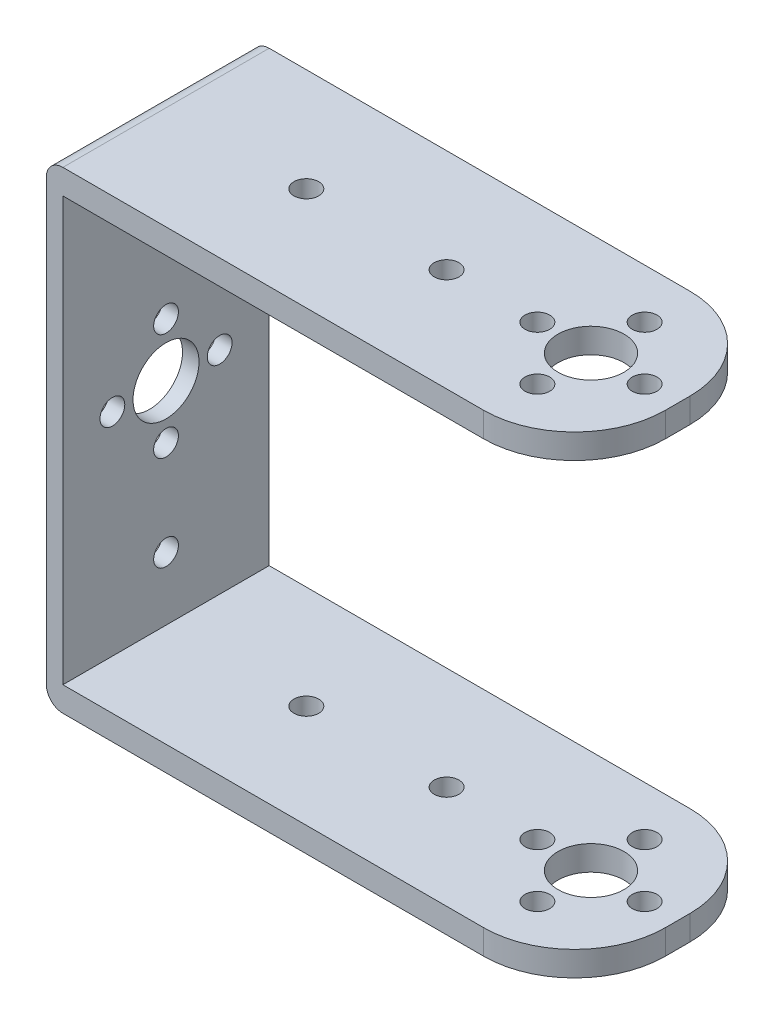
ISO-10303-21;
HEADER;
FILE_DESCRIPTION(('STEP AP214'),'2;1');
FILE_NAME('part.step','',(''),(''),'','','');
FILE_SCHEMA(('AUTOMOTIVE_DESIGN { 1 0 10303 214 1 1 1 1 }'));
ENDSEC;
DATA;
#1=APPLICATION_CONTEXT('core data for automotive mechanical design processes');
#2=APPLICATION_PROTOCOL_DEFINITION('international standard','automotive_design',2000,#1);
#3=PRODUCT_CONTEXT('',#1,'mechanical');
#4=PRODUCT('Part','Part','',(#3));
#5=PRODUCT_RELATED_PRODUCT_CATEGORY('part','',(#4));
#6=PRODUCT_DEFINITION_FORMATION('','',#4);
#7=PRODUCT_DEFINITION_CONTEXT('part definition',#1,'design');
#8=PRODUCT_DEFINITION('design','',#6,#7);
#9=PRODUCT_DEFINITION_SHAPE('','',#8);
#10=(LENGTH_UNIT() NAMED_UNIT(*) SI_UNIT(.MILLI.,.METRE.));
#11=(NAMED_UNIT(*) PLANE_ANGLE_UNIT() SI_UNIT($,.RADIAN.));
#12=(NAMED_UNIT(*) SI_UNIT($,.STERADIAN.) SOLID_ANGLE_UNIT());
#13=UNCERTAINTY_MEASURE_WITH_UNIT(LENGTH_MEASURE(1.E-05),#10,'distance_accuracy_value','');
#14=(GEOMETRIC_REPRESENTATION_CONTEXT(3) GLOBAL_UNCERTAINTY_ASSIGNED_CONTEXT((#13)) GLOBAL_UNIT_ASSIGNED_CONTEXT((#10,
#11,#12)) REPRESENTATION_CONTEXT('',''));
#15=CARTESIAN_POINT('',(0.,0.,0.));
#16=DIRECTION('',(0.,0.,1.));
#17=DIRECTION('',(1.,0.,0.));
#18=AXIS2_PLACEMENT_3D('',#15,#16,#17);
#19=CARTESIAN_POINT('',(64.,-1.,0.));
#20=DIRECTION('',(1.,0.,0.));
#21=DIRECTION('',(0.,0.,-1.));
#22=AXIS2_PLACEMENT_3D('',#19,#20,#21);
#23=PLANE('',#22);
#24=DIRECTION('',(0.,0.,-1.));
#25=VECTOR('',#24,1.);
#26=CARTESIAN_POINT('',(64.,56.3,0.));
#27=LINE('',#26,#25);
#28=CARTESIAN_POINT('',(64.,56.3,-11.));
#29=VERTEX_POINT('',#28);
#30=CARTESIAN_POINT('',(64.,56.3,-14.));
#31=VERTEX_POINT('',#30);
#32=EDGE_CURVE('E182',#29,#31,#27,.T.);
#33=ORIENTED_EDGE('',*,*,#32,.F.);
#34=DIRECTION('',(0.,1.,0.));
#35=VECTOR('',#34,1.);
#36=CARTESIAN_POINT('',(64.,-1.,-11.));
#37=LINE('',#36,#35);
#38=CARTESIAN_POINT('',(64.,53.3,-11.));
#39=VERTEX_POINT('',#38);
#40=EDGE_CURVE('E52',#29,#39,#37,.F.);
#41=ORIENTED_EDGE('',*,*,#40,.T.);
#42=DIRECTION('',(0.,0.,1.));
#43=VECTOR('',#42,1.);
#44=CARTESIAN_POINT('',(64.,53.3,-25.));
#45=LINE('',#44,#43);
#46=CARTESIAN_POINT('',(64.,53.3,-14.));
#47=VERTEX_POINT('',#46);
#48=EDGE_CURVE('E176',#47,#39,#45,.T.);
#49=ORIENTED_EDGE('',*,*,#48,.F.);
#50=DIRECTION('',(0.,1.,0.));
#51=VECTOR('',#50,1.);
#52=CARTESIAN_POINT('',(64.,-1.,-14.));
#53=LINE('',#52,#51);
#54=EDGE_CURVE('E268',#47,#31,#53,.T.);
#55=ORIENTED_EDGE('',*,*,#54,.T.);
#56=EDGE_LOOP('',(#33,#41,#49,#55));
#57=FACE_BOUND('',#56,.T.);
#58=ADVANCED_FACE('F35',(#57),#23,.T.);
#59=CARTESIAN_POINT('',(0.,-1.,0.));
#60=DIRECTION('',(-1.,0.,0.));
#61=DIRECTION('',(0.,0.,1.));
#62=AXIS2_PLACEMENT_3D('',#59,#60,#61);
#63=PLANE('',#62);
#64=CARTESIAN_POINT('',(0.,45.65,-12.5));
#65=DIRECTION('',(-1.,0.,0.));
#66=DIRECTION('',(0.,0.,1.));
#67=AXIS2_PLACEMENT_3D('',#64,#65,#66);
#68=CIRCLE('',#67,1.5);
#69=CARTESIAN_POINT('',(0.,45.65,-11.));
#70=VERTEX_POINT('',#69);
#71=EDGE_CURVE('E345',#70,#70,#68,.T.);
#72=ORIENTED_EDGE('',*,*,#71,.F.);
#73=EDGE_LOOP('',(#72));
#74=FACE_BOUND('',#73,.T.);
#75=CARTESIAN_POINT('',(0.,9.65,-12.5));
#76=DIRECTION('',(-1.,0.,0.));
#77=DIRECTION('',(0.,0.,1.));
#78=AXIS2_PLACEMENT_3D('',#75,#76,#77);
#79=CIRCLE('',#78,1.5);
#80=CARTESIAN_POINT('',(0.,9.65,-11.));
#81=VERTEX_POINT('',#80);
#82=EDGE_CURVE('E340',#81,#81,#79,.T.);
#83=ORIENTED_EDGE('',*,*,#82,.F.);
#84=EDGE_LOOP('',(#83));
#85=FACE_BOUND('',#84,.T.);
#86=CARTESIAN_POINT('',(0.,27.65,-19.));
#87=DIRECTION('',(-1.,0.,0.));
#88=DIRECTION('',(0.,0.,1.));
#89=AXIS2_PLACEMENT_3D('',#86,#87,#88);
#90=CIRCLE('',#89,1.5);
#91=CARTESIAN_POINT('',(0.,27.65,-17.5));
#92=VERTEX_POINT('',#91);
#93=EDGE_CURVE('E167',#92,#92,#90,.T.);
#94=ORIENTED_EDGE('',*,*,#93,.F.);
#95=EDGE_LOOP('',(#94));
#96=FACE_BOUND('',#95,.T.);
#97=CARTESIAN_POINT('',(0.,34.15,-12.5));
#98=DIRECTION('',(-1.,0.,0.));
#99=DIRECTION('',(0.,0.,1.));
#100=AXIS2_PLACEMENT_3D('',#97,#98,#99);
#101=CIRCLE('',#100,1.5);
#102=CARTESIAN_POINT('',(0.,34.15,-11.));
#103=VERTEX_POINT('',#102);
#104=EDGE_CURVE('E371',#103,#103,#101,.T.);
#105=ORIENTED_EDGE('',*,*,#104,.F.);
#106=EDGE_LOOP('',(#105));
#107=FACE_BOUND('',#106,.T.);
#108=CARTESIAN_POINT('',(0.,27.65,-6.));
#109=DIRECTION('',(-1.,0.,0.));
#110=DIRECTION('',(0.,0.,1.));
#111=AXIS2_PLACEMENT_3D('',#108,#109,#110);
#112=CIRCLE('',#111,1.5);
#113=CARTESIAN_POINT('',(0.,27.65,-4.5));
#114=VERTEX_POINT('',#113);
#115=EDGE_CURVE('E369',#114,#114,#112,.T.);
#116=ORIENTED_EDGE('',*,*,#115,.F.);
#117=EDGE_LOOP('',(#116));
#118=FACE_BOUND('',#117,.T.);
#119=CARTESIAN_POINT('',(0.,21.15,-12.5));
#120=DIRECTION('',(-1.,0.,0.));
#121=DIRECTION('',(0.,0.,1.));
#122=AXIS2_PLACEMENT_3D('',#119,#120,#121);
#123=CIRCLE('',#122,1.5);
#124=CARTESIAN_POINT('',(0.,21.15,-11.));
#125=VERTEX_POINT('',#124);
#126=EDGE_CURVE('E366',#125,#125,#123,.T.);
#127=ORIENTED_EDGE('',*,*,#126,.F.);
#128=EDGE_LOOP('',(#127));
#129=FACE_BOUND('',#128,.T.);
#130=CARTESIAN_POINT('',(0.,27.65,-12.5));
#131=DIRECTION('',(-1.,0.,0.));
#132=DIRECTION('',(0.,0.,1.));
#133=AXIS2_PLACEMENT_3D('',#130,#131,#132);
#134=CIRCLE('',#133,4.);
#135=CARTESIAN_POINT('',(0.,27.65,-8.5));
#136=VERTEX_POINT('',#135);
#137=EDGE_CURVE('E363',#136,#136,#134,.T.);
#138=ORIENTED_EDGE('',*,*,#137,.F.);
#139=EDGE_LOOP('',(#138));
#140=FACE_BOUND('',#139,.T.);
#141=DIRECTION('',(0.,1.,0.));
#142=VECTOR('',#141,1.);
#143=CARTESIAN_POINT('',(0.,-1.,0.));
#144=LINE('',#143,#142);
#145=CARTESIAN_POINT('',(0.,1.,0.));
#146=VERTEX_POINT('',#145);
#147=CARTESIAN_POINT('',(0.,54.3,0.));
#148=VERTEX_POINT('',#147);
#149=EDGE_CURVE('E195',#146,#148,#144,.T.);
#150=ORIENTED_EDGE('',*,*,#149,.T.);
#151=DIRECTION('',(0.,0.,1.));
#152=VECTOR('',#151,1.);
#153=CARTESIAN_POINT('',(0.,54.3,-25.));
#154=LINE('',#153,#152);
#155=CARTESIAN_POINT('',(0.,54.3,-25.));
#156=VERTEX_POINT('',#155);
#157=EDGE_CURVE('E211',#148,#156,#154,.F.);
#158=ORIENTED_EDGE('',*,*,#157,.T.);
#159=DIRECTION('',(0.,1.,0.));
#160=VECTOR('',#159,1.);
#161=CARTESIAN_POINT('',(0.,-1.,-25.));
#162=LINE('',#161,#160);
#163=CARTESIAN_POINT('',(0.,1.,-25.));
#164=VERTEX_POINT('',#163);
#165=EDGE_CURVE('E196',#164,#156,#162,.T.);
#166=ORIENTED_EDGE('',*,*,#165,.F.);
#167=DIRECTION('',(0.,0.,1.));
#168=VECTOR('',#167,1.);
#169=CARTESIAN_POINT('',(0.,1.,0.));
#170=LINE('',#169,#168);
#171=EDGE_CURVE('E208',#164,#146,#170,.T.);
#172=ORIENTED_EDGE('',*,*,#171,.T.);
#173=EDGE_LOOP('',(#150,#158,#166,#172));
#174=FACE_BOUND('',#173,.T.);
#175=ADVANCED_FACE('F381',(#74,#85,#96,#107,#118,#129,#140,#174),#63,.T.);
#176=CARTESIAN_POINT('',(0.,-1.,-25.));
#177=DIRECTION('',(0.,0.,-1.));
#178=DIRECTION('',(-1.,0.,0.));
#179=AXIS2_PLACEMENT_3D('',#176,#177,#178);
#180=PLANE('',#179);
#181=DIRECTION('',(1.,0.,0.));
#182=VECTOR('',#181,1.);
#183=CARTESIAN_POINT('',(2.00000000000001,2.,-25.));
#184=LINE('',#183,#182);
#185=CARTESIAN_POINT('',(2.00000000000001,2.,-25.));
#186=VERTEX_POINT('',#185);
#187=CARTESIAN_POINT('',(53.,2.,-25.));
#188=VERTEX_POINT('',#187);
#189=EDGE_CURVE('E153',#186,#188,#184,.T.);
#190=ORIENTED_EDGE('',*,*,#189,.T.);
#191=DIRECTION('',(0.,1.,0.));
#192=VECTOR('',#191,1.);
#193=CARTESIAN_POINT('',(53.,-1.,-25.));
#194=LINE('',#193,#192);
#195=CARTESIAN_POINT('',(53.,-1.,-25.));
#196=VERTEX_POINT('',#195);
#197=EDGE_CURVE('E252',#188,#196,#194,.F.);
#198=ORIENTED_EDGE('',*,*,#197,.T.);
#199=DIRECTION('',(-1.,0.,0.));
#200=VECTOR('',#199,1.);
#201=CARTESIAN_POINT('',(0.,-1.,-25.));
#202=LINE('',#201,#200);
#203=CARTESIAN_POINT('',(2.,-1.,-25.));
#204=VERTEX_POINT('',#203);
#205=EDGE_CURVE('E193',#196,#204,#202,.T.);
#206=ORIENTED_EDGE('',*,*,#205,.T.);
#207=CARTESIAN_POINT('',(2.,1.,-25.));
#208=DIRECTION('',(0.,0.,-1.));
#209=DIRECTION('',(-1.,0.,0.));
#210=AXIS2_PLACEMENT_3D('',#207,#208,#209);
#211=CIRCLE('',#210,2.);
#212=EDGE_CURVE('E213',#204,#164,#211,.T.);
#213=ORIENTED_EDGE('',*,*,#212,.T.);
#214=ORIENTED_EDGE('',*,*,#165,.T.);
#215=CARTESIAN_POINT('',(2.,54.3,-25.));
#216=DIRECTION('',(0.,0.,-1.));
#217=DIRECTION('',(-1.,0.,0.));
#218=AXIS2_PLACEMENT_3D('',#215,#216,#217);
#219=CIRCLE('',#218,2.);
#220=CARTESIAN_POINT('',(2.,56.3,-25.));
#221=VERTEX_POINT('',#220);
#222=EDGE_CURVE('E215',#156,#221,#219,.T.);
#223=ORIENTED_EDGE('',*,*,#222,.T.);
#224=DIRECTION('',(-1.,0.,0.));
#225=VECTOR('',#224,1.);
#226=CARTESIAN_POINT('',(0.,56.3,-25.));
#227=LINE('',#226,#225);
#228=CARTESIAN_POINT('',(53.,56.3,-25.));
#229=VERTEX_POINT('',#228);
#230=EDGE_CURVE('E185',#229,#221,#227,.T.);
#231=ORIENTED_EDGE('',*,*,#230,.F.);
#232=DIRECTION('',(0.,1.,0.));
#233=VECTOR('',#232,1.);
#234=CARTESIAN_POINT('',(53.,-1.,-25.));
#235=LINE('',#234,#233);
#236=CARTESIAN_POINT('',(53.,53.3,-25.));
#237=VERTEX_POINT('',#236);
#238=EDGE_CURVE('E250',#229,#237,#235,.F.);
#239=ORIENTED_EDGE('',*,*,#238,.T.);
#240=DIRECTION('',(-1.,0.,0.));
#241=VECTOR('',#240,1.);
#242=CARTESIAN_POINT('',(2.,53.3,-25.));
#243=LINE('',#242,#241);
#244=CARTESIAN_POINT('',(2.,53.3,-25.));
#245=VERTEX_POINT('',#244);
#246=EDGE_CURVE('E150',#237,#245,#243,.T.);
#247=ORIENTED_EDGE('',*,*,#246,.T.);
#248=DIRECTION('',(0.,-1.,0.));
#249=VECTOR('',#248,1.);
#250=CARTESIAN_POINT('',(2.,53.3,-25.));
#251=LINE('',#250,#249);
#252=EDGE_CURVE('E143',#245,#186,#251,.T.);
#253=ORIENTED_EDGE('',*,*,#252,.T.);
#254=EDGE_LOOP('',(#190,#198,#206,#213,#214,#223,#231,#239,#247,#253));
#255=FACE_BOUND('',#254,.T.);
#256=ADVANCED_FACE('F160',(#255),#180,.T.);
#257=DIRECTION('',(0.,0.,-1.));
#258=VECTOR('',#257,1.);
#259=CARTESIAN_POINT('',(64.,-1.,0.));
#260=LINE('',#259,#258);
#261=CARTESIAN_POINT('',(64.,-1.,-11.));
#262=VERTEX_POINT('',#261);
#263=CARTESIAN_POINT('',(64.,-1.,-14.));
#264=VERTEX_POINT('',#263);
#265=EDGE_CURVE('E190',#262,#264,#260,.T.);
#266=ORIENTED_EDGE('',*,*,#265,.T.);
#267=DIRECTION('',(0.,1.,0.));
#268=VECTOR('',#267,1.);
#269=CARTESIAN_POINT('',(64.,-1.,-14.));
#270=LINE('',#269,#268);
#271=CARTESIAN_POINT('',(64.,2.,-14.));
#272=VERTEX_POINT('',#271);
#273=EDGE_CURVE('E244',#264,#272,#270,.T.);
#274=ORIENTED_EDGE('',*,*,#273,.T.);
#275=DIRECTION('',(0.,0.,1.));
#276=VECTOR('',#275,1.);
#277=CARTESIAN_POINT('',(64.,2.,-25.));
#278=LINE('',#277,#276);
#279=CARTESIAN_POINT('',(64.,2.,-11.));
#280=VERTEX_POINT('',#279);
#281=EDGE_CURVE('E149',#272,#280,#278,.T.);
#282=ORIENTED_EDGE('',*,*,#281,.T.);
#283=DIRECTION('',(0.,1.,0.));
#284=VECTOR('',#283,1.);
#285=CARTESIAN_POINT('',(64.,-1.,-11.));
#286=LINE('',#285,#284);
#287=EDGE_CURVE('E221',#280,#262,#286,.F.);
#288=ORIENTED_EDGE('',*,*,#287,.T.);
#289=EDGE_LOOP('',(#266,#274,#282,#288));
#290=FACE_BOUND('',#289,.T.);
#291=ADVANCED_FACE('F420',(#290),#23,.T.);
#292=CARTESIAN_POINT('',(0.,-1.,0.));
#293=DIRECTION('',(0.,0.,1.));
#294=DIRECTION('',(1.,0.,0.));
#295=AXIS2_PLACEMENT_3D('',#292,#293,#294);
#296=PLANE('',#295);
#297=DIRECTION('',(1.,0.,0.));
#298=VECTOR('',#297,1.);
#299=CARTESIAN_POINT('',(0.,-1.,0.));
#300=LINE('',#299,#298);
#301=CARTESIAN_POINT('',(2.,-1.,0.));
#302=VERTEX_POINT('',#301);
#303=CARTESIAN_POINT('',(53.,-1.,0.));
#304=VERTEX_POINT('',#303);
#305=EDGE_CURVE('E187',#302,#304,#300,.T.);
#306=ORIENTED_EDGE('',*,*,#305,.T.);
#307=DIRECTION('',(0.,1.,0.));
#308=VECTOR('',#307,1.);
#309=CARTESIAN_POINT('',(53.,-1.,0.));
#310=LINE('',#309,#308);
#311=CARTESIAN_POINT('',(53.,2.,0.));
#312=VERTEX_POINT('',#311);
#313=EDGE_CURVE('E261',#304,#312,#310,.T.);
#314=ORIENTED_EDGE('',*,*,#313,.T.);
#315=DIRECTION('',(1.,0.,0.));
#316=VECTOR('',#315,1.);
#317=CARTESIAN_POINT('',(2.00000000000001,2.,0.));
#318=LINE('',#317,#316);
#319=CARTESIAN_POINT('',(2.00000000000001,2.,0.));
#320=VERTEX_POINT('',#319);
#321=EDGE_CURVE('E164',#320,#312,#318,.T.);
#322=ORIENTED_EDGE('',*,*,#321,.F.);
#323=DIRECTION('',(0.,-1.,0.));
#324=VECTOR('',#323,1.);
#325=CARTESIAN_POINT('',(2.,53.3,0.));
#326=LINE('',#325,#324);
#327=CARTESIAN_POINT('',(2.,53.3,0.));
#328=VERTEX_POINT('',#327);
#329=EDGE_CURVE('E145',#328,#320,#326,.T.);
#330=ORIENTED_EDGE('',*,*,#329,.F.);
#331=DIRECTION('',(-1.,0.,0.));
#332=VECTOR('',#331,1.);
#333=CARTESIAN_POINT('',(2.,53.3,0.));
#334=LINE('',#333,#332);
#335=CARTESIAN_POINT('',(53.,53.3,0.));
#336=VERTEX_POINT('',#335);
#337=EDGE_CURVE('E162',#336,#328,#334,.T.);
#338=ORIENTED_EDGE('',*,*,#337,.F.);
#339=DIRECTION('',(0.,1.,0.));
#340=VECTOR('',#339,1.);
#341=CARTESIAN_POINT('',(53.,-1.,0.));
#342=LINE('',#341,#340);
#343=CARTESIAN_POINT('',(53.,56.3,0.));
#344=VERTEX_POINT('',#343);
#345=EDGE_CURVE('E258',#336,#344,#342,.T.);
#346=ORIENTED_EDGE('',*,*,#345,.T.);
#347=DIRECTION('',(1.,0.,0.));
#348=VECTOR('',#347,1.);
#349=CARTESIAN_POINT('',(0.,56.3,0.));
#350=LINE('',#349,#348);
#351=CARTESIAN_POINT('',(2.,56.3,0.));
#352=VERTEX_POINT('',#351);
#353=EDGE_CURVE('E175',#352,#344,#350,.T.);
#354=ORIENTED_EDGE('',*,*,#353,.F.);
#355=CARTESIAN_POINT('',(2.,54.3,0.));
#356=DIRECTION('',(0.,0.,1.));
#357=DIRECTION('',(1.,0.,0.));
#358=AXIS2_PLACEMENT_3D('',#355,#356,#357);
#359=CIRCLE('',#358,2.);
#360=EDGE_CURVE('E206',#352,#148,#359,.T.);
#361=ORIENTED_EDGE('',*,*,#360,.T.);
#362=ORIENTED_EDGE('',*,*,#149,.F.);
#363=CARTESIAN_POINT('',(2.,1.,0.));
#364=DIRECTION('',(0.,0.,1.));
#365=DIRECTION('',(1.,0.,0.));
#366=AXIS2_PLACEMENT_3D('',#363,#364,#365);
#367=CIRCLE('',#366,2.);
#368=EDGE_CURVE('E204',#146,#302,#367,.T.);
#369=ORIENTED_EDGE('',*,*,#368,.T.);
#370=EDGE_LOOP('',(#306,#314,#322,#330,#338,#346,#354,#361,#362,#369));
#371=FACE_BOUND('',#370,.T.);
#372=ADVANCED_FACE('F409',(#371),#296,.T.);
#373=CARTESIAN_POINT('',(0.,-1.,0.));
#374=DIRECTION('',(0.,-1.,0.));
#375=DIRECTION('',(0.,0.,-1.));
#376=AXIS2_PLACEMENT_3D('',#373,#374,#375);
#377=PLANE('',#376);
#378=CARTESIAN_POINT('',(36.,-1.,-12.5));
#379=DIRECTION('',(0.,1.,0.));
#380=DIRECTION('',(0.,0.,1.));
#381=AXIS2_PLACEMENT_3D('',#378,#379,#380);
#382=CIRCLE('',#381,1.5);
#383=CARTESIAN_POINT('',(36.,-1.,-11.));
#384=VERTEX_POINT('',#383);
#385=EDGE_CURVE('E275',#384,#384,#382,.T.);
#386=ORIENTED_EDGE('',*,*,#385,.T.);
#387=EDGE_LOOP('',(#386));
#388=FACE_BOUND('',#387,.T.);
#389=CARTESIAN_POINT('',(19.,-1.,-12.5));
#390=DIRECTION('',(0.,1.,0.));
#391=DIRECTION('',(0.,0.,1.));
#392=AXIS2_PLACEMENT_3D('',#389,#390,#391);
#393=CIRCLE('',#392,1.5);
#394=CARTESIAN_POINT('',(19.,-1.,-11.));
#395=VERTEX_POINT('',#394);
#396=EDGE_CURVE('E286',#395,#395,#393,.T.);
#397=ORIENTED_EDGE('',*,*,#396,.T.);
#398=EDGE_LOOP('',(#397));
#399=FACE_BOUND('',#398,.T.);
#400=CARTESIAN_POINT('',(60.,-1.,-12.5));
#401=DIRECTION('',(0.,1.,0.));
#402=DIRECTION('',(0.,0.,1.));
#403=AXIS2_PLACEMENT_3D('',#400,#401,#402);
#404=CIRCLE('',#403,1.5);
#405=CARTESIAN_POINT('',(60.,-1.,-11.));
#406=VERTEX_POINT('',#405);
#407=EDGE_CURVE('E226',#406,#406,#404,.T.);
#408=ORIENTED_EDGE('',*,*,#407,.T.);
#409=EDGE_LOOP('',(#408));
#410=FACE_BOUND('',#409,.T.);
#411=CARTESIAN_POINT('',(53.5,-1.,-6.));
#412=DIRECTION('',(0.,1.,0.));
#413=DIRECTION('',(0.,0.,1.));
#414=AXIS2_PLACEMENT_3D('',#411,#412,#413);
#415=CIRCLE('',#414,1.5);
#416=CARTESIAN_POINT('',(53.5,-1.,-4.5));
#417=VERTEX_POINT('',#416);
#418=EDGE_CURVE('E311',#417,#417,#415,.T.);
#419=ORIENTED_EDGE('',*,*,#418,.T.);
#420=EDGE_LOOP('',(#419));
#421=FACE_BOUND('',#420,.T.);
#422=CARTESIAN_POINT('',(47.,-1.,-12.5));
#423=DIRECTION('',(0.,1.,0.));
#424=DIRECTION('',(0.,0.,1.));
#425=AXIS2_PLACEMENT_3D('',#422,#423,#424);
#426=CIRCLE('',#425,1.5);
#427=CARTESIAN_POINT('',(47.,-1.,-11.));
#428=VERTEX_POINT('',#427);
#429=EDGE_CURVE('E304',#428,#428,#426,.T.);
#430=ORIENTED_EDGE('',*,*,#429,.T.);
#431=EDGE_LOOP('',(#430));
#432=FACE_BOUND('',#431,.T.);
#433=CARTESIAN_POINT('',(53.5,-1.,-19.));
#434=DIRECTION('',(0.,1.,0.));
#435=DIRECTION('',(0.,0.,1.));
#436=AXIS2_PLACEMENT_3D('',#433,#434,#435);
#437=CIRCLE('',#436,1.5);
#438=CARTESIAN_POINT('',(53.5,-1.,-17.5));
#439=VERTEX_POINT('',#438);
#440=EDGE_CURVE('E321',#439,#439,#437,.T.);
#441=ORIENTED_EDGE('',*,*,#440,.T.);
#442=EDGE_LOOP('',(#441));
#443=FACE_BOUND('',#442,.T.);
#444=CARTESIAN_POINT('',(53.5,-1.,-12.5));
#445=DIRECTION('',(0.,1.,0.));
#446=DIRECTION('',(0.,0.,1.));
#447=AXIS2_PLACEMENT_3D('',#444,#445,#446);
#448=CIRCLE('',#447,4.00000000000001);
#449=CARTESIAN_POINT('',(53.5,-1.,-8.49999999999999));
#450=VERTEX_POINT('',#449);
#451=EDGE_CURVE('E303',#450,#450,#448,.T.);
#452=ORIENTED_EDGE('',*,*,#451,.T.);
#453=EDGE_LOOP('',(#452));
#454=FACE_BOUND('',#453,.T.);
#455=ORIENTED_EDGE('',*,*,#205,.F.);
#456=CARTESIAN_POINT('',(53.,-1.,-14.));
#457=DIRECTION('',(0.,-1.,0.));
#458=DIRECTION('',(0.,0.,-1.));
#459=AXIS2_PLACEMENT_3D('',#456,#457,#458);
#460=CIRCLE('',#459,11.);
#461=EDGE_CURVE('E256',#196,#264,#460,.T.);
#462=ORIENTED_EDGE('',*,*,#461,.T.);
#463=ORIENTED_EDGE('',*,*,#265,.F.);
#464=CARTESIAN_POINT('',(53.,-1.,-11.));
#465=DIRECTION('',(0.,-1.,0.));
#466=DIRECTION('',(0.,0.,-1.));
#467=AXIS2_PLACEMENT_3D('',#464,#465,#466);
#468=CIRCLE('',#467,11.);
#469=EDGE_CURVE('E254',#262,#304,#468,.T.);
#470=ORIENTED_EDGE('',*,*,#469,.T.);
#471=ORIENTED_EDGE('',*,*,#305,.F.);
#472=DIRECTION('',(0.,0.,1.));
#473=VECTOR('',#472,1.);
#474=CARTESIAN_POINT('',(2.,-1.,0.));
#475=LINE('',#474,#473);
#476=EDGE_CURVE('E218',#302,#204,#475,.F.);
#477=ORIENTED_EDGE('',*,*,#476,.T.);
#478=EDGE_LOOP('',(#455,#462,#463,#470,#471,#477));
#479=FACE_BOUND('',#478,.T.);
#480=ADVANCED_FACE('F413',(#388,#399,#410,#421,#432,#443,#454,#479),#377,.T.);
#481=CARTESIAN_POINT('',(0.,56.3,0.));
#482=DIRECTION('',(0.,-1.,0.));
#483=DIRECTION('',(0.,0.,-1.));
#484=AXIS2_PLACEMENT_3D('',#481,#482,#483);
#485=PLANE('',#484);
#486=CARTESIAN_POINT('',(36.,56.3,-12.5));
#487=DIRECTION('',(0.,1.,0.));
#488=DIRECTION('',(0.,0.,1.));
#489=AXIS2_PLACEMENT_3D('',#486,#487,#488);
#490=CIRCLE('',#489,1.5);
#491=CARTESIAN_POINT('',(36.,56.3,-11.));
#492=VERTEX_POINT('',#491);
#493=EDGE_CURVE('E281',#492,#492,#490,.T.);
#494=ORIENTED_EDGE('',*,*,#493,.F.);
#495=EDGE_LOOP('',(#494));
#496=FACE_BOUND('',#495,.T.);
#497=CARTESIAN_POINT('',(19.,56.3,-12.5));
#498=DIRECTION('',(0.,1.,0.));
#499=DIRECTION('',(0.,0.,1.));
#500=AXIS2_PLACEMENT_3D('',#497,#498,#499);
#501=CIRCLE('',#500,1.5);
#502=CARTESIAN_POINT('',(19.,56.3,-11.));
#503=VERTEX_POINT('',#502);
#504=EDGE_CURVE('E291',#503,#503,#501,.T.);
#505=ORIENTED_EDGE('',*,*,#504,.F.);
#506=EDGE_LOOP('',(#505));
#507=FACE_BOUND('',#506,.T.);
#508=CARTESIAN_POINT('',(60.,56.3,-12.5));
#509=DIRECTION('',(0.,1.,0.));
#510=DIRECTION('',(0.,0.,1.));
#511=AXIS2_PLACEMENT_3D('',#508,#509,#510);
#512=CIRCLE('',#511,1.5);
#513=CARTESIAN_POINT('',(60.,56.3,-11.));
#514=VERTEX_POINT('',#513);
#515=EDGE_CURVE('E300',#514,#514,#512,.T.);
#516=ORIENTED_EDGE('',*,*,#515,.F.);
#517=EDGE_LOOP('',(#516));
#518=FACE_BOUND('',#517,.T.);
#519=CARTESIAN_POINT('',(53.5,56.3,-6.));
#520=DIRECTION('',(0.,1.,0.));
#521=DIRECTION('',(0.,0.,1.));
#522=AXIS2_PLACEMENT_3D('',#519,#520,#521);
#523=CIRCLE('',#522,1.5);
#524=CARTESIAN_POINT('',(53.5,56.3,-4.5));
#525=VERTEX_POINT('',#524);
#526=EDGE_CURVE('E297',#525,#525,#523,.T.);
#527=ORIENTED_EDGE('',*,*,#526,.F.);
#528=EDGE_LOOP('',(#527));
#529=FACE_BOUND('',#528,.T.);
#530=CARTESIAN_POINT('',(47.,56.3,-12.5));
#531=DIRECTION('',(0.,1.,0.));
#532=DIRECTION('',(0.,0.,1.));
#533=AXIS2_PLACEMENT_3D('',#530,#531,#532);
#534=CIRCLE('',#533,1.5);
#535=CARTESIAN_POINT('',(47.,56.3,-11.));
#536=VERTEX_POINT('',#535);
#537=EDGE_CURVE('E308',#536,#536,#534,.T.);
#538=ORIENTED_EDGE('',*,*,#537,.F.);
#539=EDGE_LOOP('',(#538));
#540=FACE_BOUND('',#539,.T.);
#541=CARTESIAN_POINT('',(53.5,56.3,-19.));
#542=DIRECTION('',(0.,1.,0.));
#543=DIRECTION('',(0.,0.,1.));
#544=AXIS2_PLACEMENT_3D('',#541,#542,#543);
#545=CIRCLE('',#544,1.5);
#546=CARTESIAN_POINT('',(53.5,56.3,-17.5));
#547=VERTEX_POINT('',#546);
#548=EDGE_CURVE('E307',#547,#547,#545,.T.);
#549=ORIENTED_EDGE('',*,*,#548,.F.);
#550=EDGE_LOOP('',(#549));
#551=FACE_BOUND('',#550,.T.);
#552=CARTESIAN_POINT('',(53.5,56.3,-12.5));
#553=DIRECTION('',(0.,1.,0.));
#554=DIRECTION('',(0.,0.,1.));
#555=AXIS2_PLACEMENT_3D('',#552,#553,#554);
#556=CIRCLE('',#555,4.00000000000001);
#557=CARTESIAN_POINT('',(53.5,56.3,-8.49999999999999));
#558=VERTEX_POINT('',#557);
#559=EDGE_CURVE('E318',#558,#558,#556,.T.);
#560=ORIENTED_EDGE('',*,*,#559,.F.);
#561=EDGE_LOOP('',(#560));
#562=FACE_BOUND('',#561,.T.);
#563=ORIENTED_EDGE('',*,*,#353,.T.);
#564=CARTESIAN_POINT('',(53.,56.3,-11.));
#565=DIRECTION('',(0.,-1.,0.));
#566=DIRECTION('',(0.,0.,-1.));
#567=AXIS2_PLACEMENT_3D('',#564,#565,#566);
#568=CIRCLE('',#567,11.);
#569=EDGE_CURVE('E266',#344,#29,#568,.F.);
#570=ORIENTED_EDGE('',*,*,#569,.T.);
#571=ORIENTED_EDGE('',*,*,#32,.T.);
#572=CARTESIAN_POINT('',(53.,56.3,-14.));
#573=DIRECTION('',(0.,-1.,0.));
#574=DIRECTION('',(0.,0.,-1.));
#575=AXIS2_PLACEMENT_3D('',#572,#573,#574);
#576=CIRCLE('',#575,11.);
#577=EDGE_CURVE('E264',#31,#229,#576,.F.);
#578=ORIENTED_EDGE('',*,*,#577,.T.);
#579=ORIENTED_EDGE('',*,*,#230,.T.);
#580=DIRECTION('',(0.,0.,1.));
#581=VECTOR('',#580,1.);
#582=CARTESIAN_POINT('',(2.,56.3,0.));
#583=LINE('',#582,#581);
#584=EDGE_CURVE('E199',#221,#352,#583,.T.);
#585=ORIENTED_EDGE('',*,*,#584,.T.);
#586=EDGE_LOOP('',(#563,#570,#571,#578,#579,#585));
#587=FACE_BOUND('',#586,.T.);
#588=ADVANCED_FACE('F455',(#496,#507,#518,#529,#540,#551,#562,#587),#485,.F.);
#589=CARTESIAN_POINT('',(2.,53.3,-25.));
#590=DIRECTION('',(-1.,0.,0.));
#591=DIRECTION('',(0.,-1.,0.));
#592=AXIS2_PLACEMENT_3D('',#589,#590,#591);
#593=PLANE('',#592);
#594=CARTESIAN_POINT('',(2.,45.65,-12.5));
#595=DIRECTION('',(1.,0.,0.));
#596=DIRECTION('',(0.,1.,0.));
#597=AXIS2_PLACEMENT_3D('',#594,#595,#596);
#598=CIRCLE('',#597,1.5);
#599=CARTESIAN_POINT('',(2.,47.15,-12.5));
#600=VERTEX_POINT('',#599);
#601=EDGE_CURVE('E337',#600,#600,#598,.T.);
#602=ORIENTED_EDGE('',*,*,#601,.F.);
#603=EDGE_LOOP('',(#602));
#604=FACE_BOUND('',#603,.T.);
#605=CARTESIAN_POINT('',(2.00000000000001,9.65,-12.5));
#606=DIRECTION('',(1.,0.,0.));
#607=DIRECTION('',(0.,1.,0.));
#608=AXIS2_PLACEMENT_3D('',#605,#606,#607);
#609=CIRCLE('',#608,1.5);
#610=CARTESIAN_POINT('',(2.00000000000001,11.15,-12.5));
#611=VERTEX_POINT('',#610);
#612=EDGE_CURVE('E336',#611,#611,#609,.T.);
#613=ORIENTED_EDGE('',*,*,#612,.F.);
#614=EDGE_LOOP('',(#613));
#615=FACE_BOUND('',#614,.T.);
#616=CARTESIAN_POINT('',(2.,27.65,-19.));
#617=DIRECTION('',(1.,0.,0.));
#618=DIRECTION('',(0.,1.,0.));
#619=AXIS2_PLACEMENT_3D('',#616,#617,#618);
#620=CIRCLE('',#619,1.5);
#621=CARTESIAN_POINT('',(2.,29.15,-19.));
#622=VERTEX_POINT('',#621);
#623=EDGE_CURVE('E355',#622,#622,#620,.T.);
#624=ORIENTED_EDGE('',*,*,#623,.F.);
#625=EDGE_LOOP('',(#624));
#626=FACE_BOUND('',#625,.T.);
#627=CARTESIAN_POINT('',(2.,34.15,-12.5));
#628=DIRECTION('',(1.,0.,0.));
#629=DIRECTION('',(0.,1.,0.));
#630=AXIS2_PLACEMENT_3D('',#627,#628,#629);
#631=CIRCLE('',#630,1.5);
#632=CARTESIAN_POINT('',(2.,35.65,-12.5));
#633=VERTEX_POINT('',#632);
#634=EDGE_CURVE('E352',#633,#633,#631,.T.);
#635=ORIENTED_EDGE('',*,*,#634,.F.);
#636=EDGE_LOOP('',(#635));
#637=FACE_BOUND('',#636,.T.);
#638=CARTESIAN_POINT('',(2.,27.65,-6.));
#639=DIRECTION('',(1.,0.,0.));
#640=DIRECTION('',(0.,-1.,0.));
#641=AXIS2_PLACEMENT_3D('',#638,#639,#640);
#642=CIRCLE('',#641,1.5);
#643=CARTESIAN_POINT('',(2.,26.15,-6.));
#644=VERTEX_POINT('',#643);
#645=EDGE_CURVE('E349',#644,#644,#642,.T.);
#646=ORIENTED_EDGE('',*,*,#645,.F.);
#647=EDGE_LOOP('',(#646));
#648=FACE_BOUND('',#647,.T.);
#649=CARTESIAN_POINT('',(2.,21.15,-12.5));
#650=DIRECTION('',(1.,0.,0.));
#651=DIRECTION('',(0.,-1.,0.));
#652=AXIS2_PLACEMENT_3D('',#649,#650,#651);
#653=CIRCLE('',#652,1.5);
#654=CARTESIAN_POINT('',(2.,19.65,-12.5));
#655=VERTEX_POINT('',#654);
#656=EDGE_CURVE('E348',#655,#655,#653,.T.);
#657=ORIENTED_EDGE('',*,*,#656,.F.);
#658=EDGE_LOOP('',(#657));
#659=FACE_BOUND('',#658,.T.);
#660=CARTESIAN_POINT('',(2.,27.65,-12.5));
#661=DIRECTION('',(1.,0.,0.));
#662=DIRECTION('',(0.,1.,0.));
#663=AXIS2_PLACEMENT_3D('',#660,#661,#662);
#664=CIRCLE('',#663,4.);
#665=CARTESIAN_POINT('',(2.,31.65,-12.5));
#666=VERTEX_POINT('',#665);
#667=EDGE_CURVE('E358',#666,#666,#664,.T.);
#668=ORIENTED_EDGE('',*,*,#667,.F.);
#669=EDGE_LOOP('',(#668));
#670=FACE_BOUND('',#669,.T.);
#671=ORIENTED_EDGE('',*,*,#329,.T.);
#672=DIRECTION('',(0.,0.,1.));
#673=VECTOR('',#672,1.);
#674=CARTESIAN_POINT('',(2.00000000000001,2.,-25.));
#675=LINE('',#674,#673);
#676=EDGE_CURVE('E138',#186,#320,#675,.T.);
#677=ORIENTED_EDGE('',*,*,#676,.F.);
#678=ORIENTED_EDGE('',*,*,#252,.F.);
#679=DIRECTION('',(0.,0.,1.));
#680=VECTOR('',#679,1.);
#681=CARTESIAN_POINT('',(2.,53.3,-25.));
#682=LINE('',#681,#680);
#683=EDGE_CURVE('E173',#245,#328,#682,.T.);
#684=ORIENTED_EDGE('',*,*,#683,.T.);
#685=EDGE_LOOP('',(#671,#677,#678,#684));
#686=FACE_BOUND('',#685,.T.);
#687=ADVANCED_FACE('F140',(#604,#615,#626,#637,#648,#659,#670,#686),#593,.F.);
#688=CARTESIAN_POINT('',(2.,53.3,-25.));
#689=DIRECTION('',(0.,1.,0.));
#690=DIRECTION('',(0.,0.,1.));
#691=AXIS2_PLACEMENT_3D('',#688,#689,#690);
#692=PLANE('',#691);
#693=CARTESIAN_POINT('',(36.,53.3,-12.5));
#694=DIRECTION('',(0.,1.,0.));
#695=DIRECTION('',(0.,0.,1.));
#696=AXIS2_PLACEMENT_3D('',#693,#694,#695);
#697=CIRCLE('',#696,1.5);
#698=CARTESIAN_POINT('',(36.,53.3,-11.));
#699=VERTEX_POINT('',#698);
#700=EDGE_CURVE('E294',#699,#699,#697,.T.);
#701=ORIENTED_EDGE('',*,*,#700,.T.);
#702=EDGE_LOOP('',(#701));
#703=FACE_BOUND('',#702,.T.);
#704=CARTESIAN_POINT('',(19.,53.3,-12.5));
#705=DIRECTION('',(0.,1.,0.));
#706=DIRECTION('',(0.,0.,1.));
#707=AXIS2_PLACEMENT_3D('',#704,#705,#706);
#708=CIRCLE('',#707,1.5);
#709=CARTESIAN_POINT('',(19.,53.3,-11.));
#710=VERTEX_POINT('',#709);
#711=EDGE_CURVE('E274',#710,#710,#708,.T.);
#712=ORIENTED_EDGE('',*,*,#711,.T.);
#713=EDGE_LOOP('',(#712));
#714=FACE_BOUND('',#713,.T.);
#715=CARTESIAN_POINT('',(60.,53.3,-12.5));
#716=DIRECTION('',(0.,1.,0.));
#717=DIRECTION('',(0.,0.,1.));
#718=AXIS2_PLACEMENT_3D('',#715,#716,#717);
#719=CIRCLE('',#718,1.5);
#720=CARTESIAN_POINT('',(60.,53.3,-11.));
#721=VERTEX_POINT('',#720);
#722=EDGE_CURVE('E242',#721,#721,#719,.T.);
#723=ORIENTED_EDGE('',*,*,#722,.T.);
#724=EDGE_LOOP('',(#723));
#725=FACE_BOUND('',#724,.T.);
#726=CARTESIAN_POINT('',(53.5,53.3,-6.));
#727=DIRECTION('',(0.,1.,0.));
#728=DIRECTION('',(0.,0.,1.));
#729=AXIS2_PLACEMENT_3D('',#726,#727,#728);
#730=CIRCLE('',#729,1.5);
#731=CARTESIAN_POINT('',(53.5,53.3,-4.5));
#732=VERTEX_POINT('',#731);
#733=EDGE_CURVE('E238',#732,#732,#730,.T.);
#734=ORIENTED_EDGE('',*,*,#733,.T.);
#735=EDGE_LOOP('',(#734));
#736=FACE_BOUND('',#735,.T.);
#737=CARTESIAN_POINT('',(47.,53.3,-12.5));
#738=DIRECTION('',(0.,1.,0.));
#739=DIRECTION('',(0.,0.,1.));
#740=AXIS2_PLACEMENT_3D('',#737,#738,#739);
#741=CIRCLE('',#740,1.5);
#742=CARTESIAN_POINT('',(47.,53.3,-11.));
#743=VERTEX_POINT('',#742);
#744=EDGE_CURVE('E234',#743,#743,#741,.T.);
#745=ORIENTED_EDGE('',*,*,#744,.T.);
#746=EDGE_LOOP('',(#745));
#747=FACE_BOUND('',#746,.T.);
#748=CARTESIAN_POINT('',(53.5,53.3,-19.));
#749=DIRECTION('',(0.,1.,0.));
#750=DIRECTION('',(0.,0.,1.));
#751=AXIS2_PLACEMENT_3D('',#748,#749,#750);
#752=CIRCLE('',#751,1.5);
#753=CARTESIAN_POINT('',(53.5,53.3,-17.5));
#754=VERTEX_POINT('',#753);
#755=EDGE_CURVE('E230',#754,#754,#752,.T.);
#756=ORIENTED_EDGE('',*,*,#755,.T.);
#757=EDGE_LOOP('',(#756));
#758=FACE_BOUND('',#757,.T.);
#759=CARTESIAN_POINT('',(53.5,53.3,-12.5));
#760=DIRECTION('',(0.,1.,0.));
#761=DIRECTION('',(0.,0.,1.));
#762=AXIS2_PLACEMENT_3D('',#759,#760,#761);
#763=CIRCLE('',#762,4.00000000000001);
#764=CARTESIAN_POINT('',(53.5,53.3,-8.49999999999999));
#765=VERTEX_POINT('',#764);
#766=EDGE_CURVE('E225',#765,#765,#763,.T.);
#767=ORIENTED_EDGE('',*,*,#766,.T.);
#768=EDGE_LOOP('',(#767));
#769=FACE_BOUND('',#768,.T.);
#770=ORIENTED_EDGE('',*,*,#48,.T.);
#771=CARTESIAN_POINT('',(53.,53.3,-11.));
#772=DIRECTION('',(0.,1.,0.));
#773=DIRECTION('',(0.,0.,1.));
#774=AXIS2_PLACEMENT_3D('',#771,#772,#773);
#775=CIRCLE('',#774,11.);
#776=EDGE_CURVE('E11',#39,#336,#775,.F.);
#777=ORIENTED_EDGE('',*,*,#776,.T.);
#778=ORIENTED_EDGE('',*,*,#337,.T.);
#779=ORIENTED_EDGE('',*,*,#683,.F.);
#780=ORIENTED_EDGE('',*,*,#246,.F.);
#781=CARTESIAN_POINT('',(53.,53.3,-14.));
#782=DIRECTION('',(0.,1.,0.));
#783=DIRECTION('',(0.,0.,1.));
#784=AXIS2_PLACEMENT_3D('',#781,#782,#783);
#785=CIRCLE('',#784,11.);
#786=EDGE_CURVE('E44',#237,#47,#785,.F.);
#787=ORIENTED_EDGE('',*,*,#786,.T.);
#788=EDGE_LOOP('',(#770,#777,#778,#779,#780,#787));
#789=FACE_BOUND('',#788,.T.);
#790=ADVANCED_FACE('F461',(#703,#714,#725,#736,#747,#758,#769,#789),#692,.F.);
#791=CARTESIAN_POINT('',(2.00000000000001,2.,-25.));
#792=DIRECTION('',(0.,-1.,0.));
#793=DIRECTION('',(1.,0.,0.));
#794=AXIS2_PLACEMENT_3D('',#791,#792,#793);
#795=PLANE('',#794);
#796=CARTESIAN_POINT('',(36.,2.,-12.5));
#797=DIRECTION('',(0.,-1.,0.));
#798=DIRECTION('',(1.,0.,0.));
#799=AXIS2_PLACEMENT_3D('',#796,#797,#798);
#800=CIRCLE('',#799,1.5);
#801=CARTESIAN_POINT('',(37.5,2.,-12.5));
#802=VERTEX_POINT('',#801);
#803=EDGE_CURVE('E39',#802,#802,#800,.T.);
#804=ORIENTED_EDGE('',*,*,#803,.T.);
#805=EDGE_LOOP('',(#804));
#806=FACE_BOUND('',#805,.T.);
#807=CARTESIAN_POINT('',(19.,2.,-12.5));
#808=DIRECTION('',(0.,-1.,0.));
#809=DIRECTION('',(1.,0.,0.));
#810=AXIS2_PLACEMENT_3D('',#807,#808,#809);
#811=CIRCLE('',#810,1.5);
#812=CARTESIAN_POINT('',(20.5,2.,-12.5));
#813=VERTEX_POINT('',#812);
#814=EDGE_CURVE('E272',#813,#813,#811,.T.);
#815=ORIENTED_EDGE('',*,*,#814,.T.);
#816=EDGE_LOOP('',(#815));
#817=FACE_BOUND('',#816,.T.);
#818=CARTESIAN_POINT('',(60.,2.,-12.5));
#819=DIRECTION('',(0.,-1.,0.));
#820=DIRECTION('',(1.,0.,0.));
#821=AXIS2_PLACEMENT_3D('',#818,#819,#820);
#822=CIRCLE('',#821,1.5);
#823=CARTESIAN_POINT('',(61.5,2.,-12.5));
#824=VERTEX_POINT('',#823);
#825=EDGE_CURVE('E239',#824,#824,#822,.T.);
#826=ORIENTED_EDGE('',*,*,#825,.T.);
#827=EDGE_LOOP('',(#826));
#828=FACE_BOUND('',#827,.T.);
#829=CARTESIAN_POINT('',(53.5,2.,-6.));
#830=DIRECTION('',(0.,-1.,0.));
#831=DIRECTION('',(1.,0.,0.));
#832=AXIS2_PLACEMENT_3D('',#829,#830,#831);
#833=CIRCLE('',#832,1.5);
#834=CARTESIAN_POINT('',(55.,2.,-6.));
#835=VERTEX_POINT('',#834);
#836=EDGE_CURVE('E235',#835,#835,#833,.T.);
#837=ORIENTED_EDGE('',*,*,#836,.T.);
#838=EDGE_LOOP('',(#837));
#839=FACE_BOUND('',#838,.T.);
#840=CARTESIAN_POINT('',(47.,2.,-12.5));
#841=DIRECTION('',(0.,-1.,0.));
#842=DIRECTION('',(1.,0.,0.));
#843=AXIS2_PLACEMENT_3D('',#840,#841,#842);
#844=CIRCLE('',#843,1.5);
#845=CARTESIAN_POINT('',(48.5,2.,-12.5));
#846=VERTEX_POINT('',#845);
#847=EDGE_CURVE('E231',#846,#846,#844,.T.);
#848=ORIENTED_EDGE('',*,*,#847,.T.);
#849=EDGE_LOOP('',(#848));
#850=FACE_BOUND('',#849,.T.);
#851=CARTESIAN_POINT('',(53.5,2.,-19.));
#852=DIRECTION('',(0.,-1.,0.));
#853=DIRECTION('',(1.,0.,0.));
#854=AXIS2_PLACEMENT_3D('',#851,#852,#853);
#855=CIRCLE('',#854,1.5);
#856=CARTESIAN_POINT('',(55.,2.,-19.));
#857=VERTEX_POINT('',#856);
#858=EDGE_CURVE('E227',#857,#857,#855,.T.);
#859=ORIENTED_EDGE('',*,*,#858,.T.);
#860=EDGE_LOOP('',(#859));
#861=FACE_BOUND('',#860,.T.);
#862=CARTESIAN_POINT('',(53.5,2.,-12.5));
#863=DIRECTION('',(0.,-1.,0.));
#864=DIRECTION('',(1.,0.,0.));
#865=AXIS2_PLACEMENT_3D('',#862,#863,#864);
#866=CIRCLE('',#865,4.00000000000001);
#867=CARTESIAN_POINT('',(57.5,2.,-12.5));
#868=VERTEX_POINT('',#867);
#869=EDGE_CURVE('E222',#868,#868,#866,.T.);
#870=ORIENTED_EDGE('',*,*,#869,.T.);
#871=EDGE_LOOP('',(#870));
#872=FACE_BOUND('',#871,.T.);
#873=ORIENTED_EDGE('',*,*,#281,.F.);
#874=CARTESIAN_POINT('',(53.,2.,-14.));
#875=DIRECTION('',(0.,-1.,0.));
#876=DIRECTION('',(1.,0.,0.));
#877=AXIS2_PLACEMENT_3D('',#874,#875,#876);
#878=CIRCLE('',#877,11.);
#879=EDGE_CURVE('E156',#272,#188,#878,.F.);
#880=ORIENTED_EDGE('',*,*,#879,.T.);
#881=ORIENTED_EDGE('',*,*,#189,.F.);
#882=ORIENTED_EDGE('',*,*,#676,.T.);
#883=ORIENTED_EDGE('',*,*,#321,.T.);
#884=CARTESIAN_POINT('',(53.,2.,-11.));
#885=DIRECTION('',(0.,-1.,0.));
#886=DIRECTION('',(1.,0.,0.));
#887=AXIS2_PLACEMENT_3D('',#884,#885,#886);
#888=CIRCLE('',#887,11.);
#889=EDGE_CURVE('E247',#312,#280,#888,.F.);
#890=ORIENTED_EDGE('',*,*,#889,.T.);
#891=EDGE_LOOP('',(#873,#880,#881,#882,#883,#890));
#892=FACE_BOUND('',#891,.T.);
#893=ADVANCED_FACE('F155',(#806,#817,#828,#839,#850,#861,#872,#892),#795,.F.);
#894=CARTESIAN_POINT('',(-54.,27.65,-12.5));
#895=DIRECTION('',(1.,0.,0.));
#896=DIRECTION('',(0.,1.,0.));
#897=AXIS2_PLACEMENT_3D('',#894,#895,#896);
#898=CYLINDRICAL_SURFACE('',#897,4.);
#899=ORIENTED_EDGE('',*,*,#137,.T.);
#900=EDGE_LOOP('',(#899));
#901=FACE_BOUND('',#900,.T.);
#902=ORIENTED_EDGE('',*,*,#667,.T.);
#903=EDGE_LOOP('',(#902));
#904=FACE_BOUND('',#903,.T.);
#905=ADVANCED_FACE('F465',(#901,#904),#898,.F.);
#906=CARTESIAN_POINT('',(-54.,21.15,-12.5));
#907=DIRECTION('',(1.,0.,0.));
#908=DIRECTION('',(0.,1.,0.));
#909=AXIS2_PLACEMENT_3D('',#906,#907,#908);
#910=CYLINDRICAL_SURFACE('',#909,1.5);
#911=ORIENTED_EDGE('',*,*,#126,.T.);
#912=EDGE_LOOP('',(#911));
#913=FACE_BOUND('',#912,.T.);
#914=ORIENTED_EDGE('',*,*,#656,.T.);
#915=EDGE_LOOP('',(#914));
#916=FACE_BOUND('',#915,.T.);
#917=ADVANCED_FACE('F472',(#913,#916),#910,.F.);
#918=CARTESIAN_POINT('',(-54.,27.65,-6.));
#919=DIRECTION('',(1.,0.,0.));
#920=DIRECTION('',(0.,1.,0.));
#921=AXIS2_PLACEMENT_3D('',#918,#919,#920);
#922=CYLINDRICAL_SURFACE('',#921,1.5);
#923=ORIENTED_EDGE('',*,*,#115,.T.);
#924=EDGE_LOOP('',(#923));
#925=FACE_BOUND('',#924,.T.);
#926=ORIENTED_EDGE('',*,*,#645,.T.);
#927=EDGE_LOOP('',(#926));
#928=FACE_BOUND('',#927,.T.);
#929=ADVANCED_FACE('F477',(#925,#928),#922,.F.);
#930=CARTESIAN_POINT('',(-54.,34.15,-12.5));
#931=DIRECTION('',(1.,0.,0.));
#932=DIRECTION('',(0.,1.,0.));
#933=AXIS2_PLACEMENT_3D('',#930,#931,#932);
#934=CYLINDRICAL_SURFACE('',#933,1.5);
#935=ORIENTED_EDGE('',*,*,#104,.T.);
#936=EDGE_LOOP('',(#935));
#937=FACE_BOUND('',#936,.T.);
#938=ORIENTED_EDGE('',*,*,#634,.T.);
#939=EDGE_LOOP('',(#938));
#940=FACE_BOUND('',#939,.T.);
#941=ADVANCED_FACE('F474',(#937,#940),#934,.F.);
#942=CARTESIAN_POINT('',(-54.,27.65,-19.));
#943=DIRECTION('',(1.,0.,0.));
#944=DIRECTION('',(0.,1.,0.));
#945=AXIS2_PLACEMENT_3D('',#942,#943,#944);
#946=CYLINDRICAL_SURFACE('',#945,1.5);
#947=ORIENTED_EDGE('',*,*,#93,.T.);
#948=EDGE_LOOP('',(#947));
#949=FACE_BOUND('',#948,.T.);
#950=ORIENTED_EDGE('',*,*,#623,.T.);
#951=EDGE_LOOP('',(#950));
#952=FACE_BOUND('',#951,.T.);
#953=ADVANCED_FACE('F378',(#949,#952),#946,.F.);
#954=CARTESIAN_POINT('',(-54.,9.64999999999999,-12.5));
#955=DIRECTION('',(1.,0.,0.));
#956=DIRECTION('',(0.,1.,0.));
#957=AXIS2_PLACEMENT_3D('',#954,#955,#956);
#958=CYLINDRICAL_SURFACE('',#957,1.5);
#959=ORIENTED_EDGE('',*,*,#82,.T.);
#960=EDGE_LOOP('',(#959));
#961=FACE_BOUND('',#960,.T.);
#962=ORIENTED_EDGE('',*,*,#612,.T.);
#963=EDGE_LOOP('',(#962));
#964=FACE_BOUND('',#963,.T.);
#965=ADVANCED_FACE('F480',(#961,#964),#958,.F.);
#966=CARTESIAN_POINT('',(-54.,45.65,-12.5));
#967=DIRECTION('',(1.,0.,0.));
#968=DIRECTION('',(0.,1.,0.));
#969=AXIS2_PLACEMENT_3D('',#966,#967,#968);
#970=CYLINDRICAL_SURFACE('',#969,1.5);
#971=ORIENTED_EDGE('',*,*,#71,.T.);
#972=EDGE_LOOP('',(#971));
#973=FACE_BOUND('',#972,.T.);
#974=ORIENTED_EDGE('',*,*,#601,.T.);
#975=EDGE_LOOP('',(#974));
#976=FACE_BOUND('',#975,.T.);
#977=ADVANCED_FACE('F489',(#973,#976),#970,.F.);
#978=CARTESIAN_POINT('',(2.,54.3,0.));
#979=DIRECTION('',(0.,0.,-1.));
#980=DIRECTION('',(-1.,0.,0.));
#981=AXIS2_PLACEMENT_3D('',#978,#979,#980);
#982=CYLINDRICAL_SURFACE('',#981,2.);
#983=ORIENTED_EDGE('',*,*,#222,.F.);
#984=ORIENTED_EDGE('',*,*,#157,.F.);
#985=ORIENTED_EDGE('',*,*,#360,.F.);
#986=ORIENTED_EDGE('',*,*,#584,.F.);
#987=EDGE_LOOP('',(#983,#984,#985,#986));
#988=FACE_BOUND('',#987,.T.);
#989=ADVANCED_FACE('F400',(#988),#982,.T.);
#990=CARTESIAN_POINT('',(2.,1.,0.));
#991=DIRECTION('',(0.,0.,1.));
#992=DIRECTION('',(1.,0.,0.));
#993=AXIS2_PLACEMENT_3D('',#990,#991,#992);
#994=CYLINDRICAL_SURFACE('',#993,2.);
#995=ORIENTED_EDGE('',*,*,#212,.F.);
#996=ORIENTED_EDGE('',*,*,#476,.F.);
#997=ORIENTED_EDGE('',*,*,#368,.F.);
#998=ORIENTED_EDGE('',*,*,#171,.F.);
#999=EDGE_LOOP('',(#995,#996,#997,#998));
#1000=FACE_BOUND('',#999,.T.);
#1001=ADVANCED_FACE('F406',(#1000),#994,.T.);
#1002=CARTESIAN_POINT('',(53.5,-1.,-12.5));
#1003=DIRECTION('',(0.,1.,0.));
#1004=DIRECTION('',(0.,0.,1.));
#1005=AXIS2_PLACEMENT_3D('',#1002,#1003,#1004);
#1006=CYLINDRICAL_SURFACE('',#1005,4.00000000000001);
#1007=ORIENTED_EDGE('',*,*,#451,.F.);
#1008=EDGE_LOOP('',(#1007));
#1009=FACE_BOUND('',#1008,.T.);
#1010=ORIENTED_EDGE('',*,*,#869,.F.);
#1011=EDGE_LOOP('',(#1010));
#1012=FACE_BOUND('',#1011,.T.);
#1013=ADVANCED_FACE('F504',(#1009,#1012),#1006,.F.);
#1014=CARTESIAN_POINT('',(53.5,-1.,-19.));
#1015=DIRECTION('',(0.,1.,0.));
#1016=DIRECTION('',(0.,0.,1.));
#1017=AXIS2_PLACEMENT_3D('',#1014,#1015,#1016);
#1018=CYLINDRICAL_SURFACE('',#1017,1.5);
#1019=ORIENTED_EDGE('',*,*,#440,.F.);
#1020=EDGE_LOOP('',(#1019));
#1021=FACE_BOUND('',#1020,.T.);
#1022=ORIENTED_EDGE('',*,*,#858,.F.);
#1023=EDGE_LOOP('',(#1022));
#1024=FACE_BOUND('',#1023,.T.);
#1025=ADVANCED_FACE('F500',(#1021,#1024),#1018,.F.);
#1026=CARTESIAN_POINT('',(47.,-1.,-12.5));
#1027=DIRECTION('',(0.,1.,0.));
#1028=DIRECTION('',(0.,0.,1.));
#1029=AXIS2_PLACEMENT_3D('',#1026,#1027,#1028);
#1030=CYLINDRICAL_SURFACE('',#1029,1.5);
#1031=ORIENTED_EDGE('',*,*,#429,.F.);
#1032=EDGE_LOOP('',(#1031));
#1033=FACE_BOUND('',#1032,.T.);
#1034=ORIENTED_EDGE('',*,*,#847,.F.);
#1035=EDGE_LOOP('',(#1034));
#1036=FACE_BOUND('',#1035,.T.);
#1037=ADVANCED_FACE('F511',(#1033,#1036),#1030,.F.);
#1038=CARTESIAN_POINT('',(53.5,-1.,-6.));
#1039=DIRECTION('',(0.,1.,0.));
#1040=DIRECTION('',(0.,0.,1.));
#1041=AXIS2_PLACEMENT_3D('',#1038,#1039,#1040);
#1042=CYLINDRICAL_SURFACE('',#1041,1.5);
#1043=ORIENTED_EDGE('',*,*,#418,.F.);
#1044=EDGE_LOOP('',(#1043));
#1045=FACE_BOUND('',#1044,.T.);
#1046=ORIENTED_EDGE('',*,*,#836,.F.);
#1047=EDGE_LOOP('',(#1046));
#1048=FACE_BOUND('',#1047,.T.);
#1049=ADVANCED_FACE('F508',(#1045,#1048),#1042,.F.);
#1050=CARTESIAN_POINT('',(60.,-1.,-12.5));
#1051=DIRECTION('',(0.,1.,0.));
#1052=DIRECTION('',(0.,0.,1.));
#1053=AXIS2_PLACEMENT_3D('',#1050,#1051,#1052);
#1054=CYLINDRICAL_SURFACE('',#1053,1.5);
#1055=ORIENTED_EDGE('',*,*,#407,.F.);
#1056=EDGE_LOOP('',(#1055));
#1057=FACE_BOUND('',#1056,.T.);
#1058=ORIENTED_EDGE('',*,*,#825,.F.);
#1059=EDGE_LOOP('',(#1058));
#1060=FACE_BOUND('',#1059,.T.);
#1061=ADVANCED_FACE('F437',(#1057,#1060),#1054,.F.);
#1062=ORIENTED_EDGE('',*,*,#559,.T.);
#1063=EDGE_LOOP('',(#1062));
#1064=FACE_BOUND('',#1063,.T.);
#1065=ORIENTED_EDGE('',*,*,#766,.F.);
#1066=EDGE_LOOP('',(#1065));
#1067=FACE_BOUND('',#1066,.T.);
#1068=ADVANCED_FACE('F498',(#1064,#1067),#1006,.F.);
#1069=ORIENTED_EDGE('',*,*,#548,.T.);
#1070=EDGE_LOOP('',(#1069));
#1071=FACE_BOUND('',#1070,.T.);
#1072=ORIENTED_EDGE('',*,*,#755,.F.);
#1073=EDGE_LOOP('',(#1072));
#1074=FACE_BOUND('',#1073,.T.);
#1075=ADVANCED_FACE('F494',(#1071,#1074),#1018,.F.);
#1076=ORIENTED_EDGE('',*,*,#537,.T.);
#1077=EDGE_LOOP('',(#1076));
#1078=FACE_BOUND('',#1077,.T.);
#1079=ORIENTED_EDGE('',*,*,#744,.F.);
#1080=EDGE_LOOP('',(#1079));
#1081=FACE_BOUND('',#1080,.T.);
#1082=ADVANCED_FACE('F497',(#1078,#1081),#1030,.F.);
#1083=ORIENTED_EDGE('',*,*,#526,.T.);
#1084=EDGE_LOOP('',(#1083));
#1085=FACE_BOUND('',#1084,.T.);
#1086=ORIENTED_EDGE('',*,*,#733,.F.);
#1087=EDGE_LOOP('',(#1086));
#1088=FACE_BOUND('',#1087,.T.);
#1089=ADVANCED_FACE('F434',(#1085,#1088),#1042,.F.);
#1090=ORIENTED_EDGE('',*,*,#515,.T.);
#1091=EDGE_LOOP('',(#1090));
#1092=FACE_BOUND('',#1091,.T.);
#1093=ORIENTED_EDGE('',*,*,#722,.F.);
#1094=EDGE_LOOP('',(#1093));
#1095=FACE_BOUND('',#1094,.T.);
#1096=ADVANCED_FACE('F426',(#1092,#1095),#1054,.F.);
#1097=CARTESIAN_POINT('',(53.,-1.,-14.));
#1098=DIRECTION('',(0.,1.,0.));
#1099=DIRECTION('',(0.,0.,1.));
#1100=AXIS2_PLACEMENT_3D('',#1097,#1098,#1099);
#1101=CYLINDRICAL_SURFACE('',#1100,11.);
#1102=ORIENTED_EDGE('',*,*,#461,.F.);
#1103=ORIENTED_EDGE('',*,*,#197,.F.);
#1104=ORIENTED_EDGE('',*,*,#879,.F.);
#1105=ORIENTED_EDGE('',*,*,#273,.F.);
#1106=EDGE_LOOP('',(#1102,#1103,#1104,#1105));
#1107=FACE_BOUND('',#1106,.T.);
#1108=ADVANCED_FACE('F424',(#1107),#1101,.T.);
#1109=CARTESIAN_POINT('',(53.,-1.,-11.));
#1110=DIRECTION('',(0.,1.,0.));
#1111=DIRECTION('',(0.,0.,1.));
#1112=AXIS2_PLACEMENT_3D('',#1109,#1110,#1111);
#1113=CYLINDRICAL_SURFACE('',#1112,11.);
#1114=ORIENTED_EDGE('',*,*,#469,.F.);
#1115=ORIENTED_EDGE('',*,*,#287,.F.);
#1116=ORIENTED_EDGE('',*,*,#889,.F.);
#1117=ORIENTED_EDGE('',*,*,#313,.F.);
#1118=EDGE_LOOP('',(#1114,#1115,#1116,#1117));
#1119=FACE_BOUND('',#1118,.T.);
#1120=ADVANCED_FACE('F418',(#1119),#1113,.T.);
#1121=CARTESIAN_POINT('',(53.,-1.,-11.));
#1122=DIRECTION('',(0.,1.,0.));
#1123=DIRECTION('',(0.,0.,1.));
#1124=AXIS2_PLACEMENT_3D('',#1121,#1122,#1123);
#1125=CYLINDRICAL_SURFACE('',#1124,11.);
#1126=ORIENTED_EDGE('',*,*,#776,.F.);
#1127=ORIENTED_EDGE('',*,*,#40,.F.);
#1128=ORIENTED_EDGE('',*,*,#569,.F.);
#1129=ORIENTED_EDGE('',*,*,#345,.F.);
#1130=EDGE_LOOP('',(#1126,#1127,#1128,#1129));
#1131=FACE_BOUND('',#1130,.T.);
#1132=ADVANCED_FACE('F432',(#1131),#1125,.T.);
#1133=CARTESIAN_POINT('',(53.,-1.,-14.));
#1134=DIRECTION('',(0.,1.,0.));
#1135=DIRECTION('',(0.,0.,1.));
#1136=AXIS2_PLACEMENT_3D('',#1133,#1134,#1135);
#1137=CYLINDRICAL_SURFACE('',#1136,11.);
#1138=ORIENTED_EDGE('',*,*,#786,.F.);
#1139=ORIENTED_EDGE('',*,*,#238,.F.);
#1140=ORIENTED_EDGE('',*,*,#577,.F.);
#1141=ORIENTED_EDGE('',*,*,#54,.F.);
#1142=EDGE_LOOP('',(#1138,#1139,#1140,#1141));
#1143=FACE_BOUND('',#1142,.T.);
#1144=ADVANCED_FACE('F37',(#1143),#1137,.T.);
#1145=CARTESIAN_POINT('',(19.,-1.,-12.5));
#1146=DIRECTION('',(0.,1.,0.));
#1147=DIRECTION('',(0.,0.,1.));
#1148=AXIS2_PLACEMENT_3D('',#1145,#1146,#1147);
#1149=CYLINDRICAL_SURFACE('',#1148,1.5);
#1150=ORIENTED_EDGE('',*,*,#396,.F.);
#1151=EDGE_LOOP('',(#1150));
#1152=FACE_BOUND('',#1151,.T.);
#1153=ORIENTED_EDGE('',*,*,#814,.F.);
#1154=EDGE_LOOP('',(#1153));
#1155=FACE_BOUND('',#1154,.T.);
#1156=ADVANCED_FACE('F519',(#1152,#1155),#1149,.F.);
#1157=CARTESIAN_POINT('',(36.,-1.,-12.5));
#1158=DIRECTION('',(0.,1.,0.));
#1159=DIRECTION('',(0.,0.,1.));
#1160=AXIS2_PLACEMENT_3D('',#1157,#1158,#1159);
#1161=CYLINDRICAL_SURFACE('',#1160,1.5);
#1162=ORIENTED_EDGE('',*,*,#385,.F.);
#1163=EDGE_LOOP('',(#1162));
#1164=FACE_BOUND('',#1163,.T.);
#1165=ORIENTED_EDGE('',*,*,#803,.F.);
#1166=EDGE_LOOP('',(#1165));
#1167=FACE_BOUND('',#1166,.T.);
#1168=ADVANCED_FACE('F517',(#1164,#1167),#1161,.F.);
#1169=ORIENTED_EDGE('',*,*,#504,.T.);
#1170=EDGE_LOOP('',(#1169));
#1171=FACE_BOUND('',#1170,.T.);
#1172=ORIENTED_EDGE('',*,*,#711,.F.);
#1173=EDGE_LOOP('',(#1172));
#1174=FACE_BOUND('',#1173,.T.);
#1175=ADVANCED_FACE('F513',(#1171,#1174),#1149,.F.);
#1176=ORIENTED_EDGE('',*,*,#493,.T.);
#1177=EDGE_LOOP('',(#1176));
#1178=FACE_BOUND('',#1177,.T.);
#1179=ORIENTED_EDGE('',*,*,#700,.F.);
#1180=EDGE_LOOP('',(#1179));
#1181=FACE_BOUND('',#1180,.T.);
#1182=ADVANCED_FACE('F516',(#1178,#1181),#1161,.F.);
#1183=CLOSED_SHELL('',(#58,#175,#256,#291,#372,#480,#588,#687,#790,#893,#905,#917,#929,#941,
#953,#965,#977,#989,#1001,#1013,#1025,#1037,#1049,#1061,#1068,#1075,#1082,#1089,#1096,#1108,
#1120,#1132,#1144,#1156,#1168,#1175,#1182));
#1184=MANIFOLD_SOLID_BREP('B2',#1183);
#1185=ADVANCED_BREP_SHAPE_REPRESENTATION('',(#18,#1184),#14);
#1186=SHAPE_DEFINITION_REPRESENTATION(#9,#1185);
ENDSEC;
END-ISO-10303-21;
